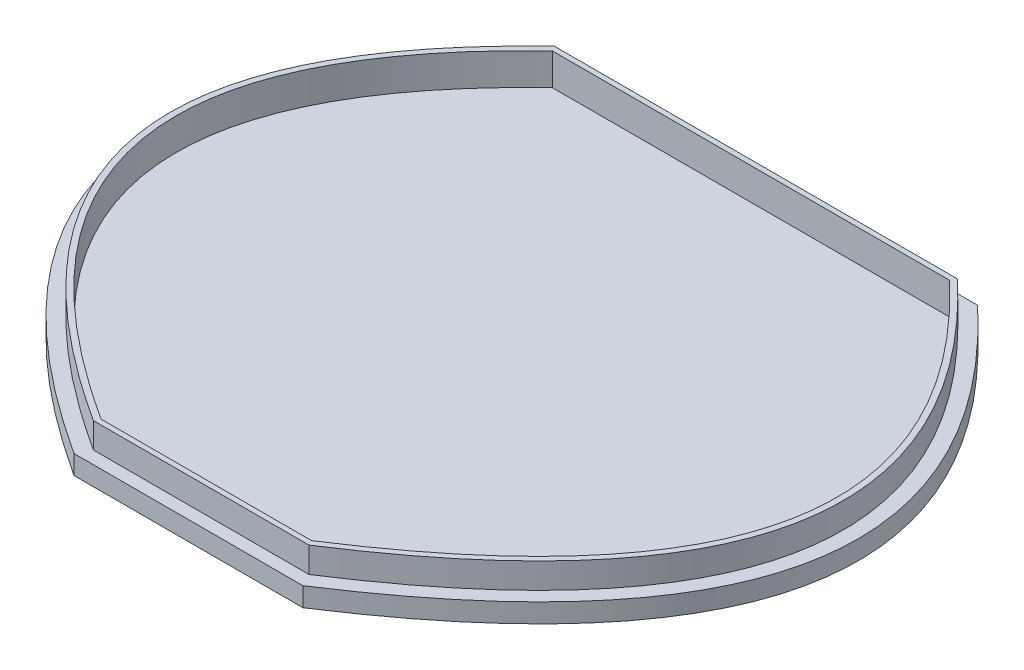
ISO-10303-21;
HEADER;
FILE_DESCRIPTION(('STEP AP214'),'2;1');
FILE_NAME('part.step','',(''),(''),'','','');
FILE_SCHEMA(('AUTOMOTIVE_DESIGN { 1 0 10303 214 1 1 1 1 }'));
ENDSEC;
DATA;
#1=APPLICATION_CONTEXT('core data for automotive mechanical design processes');
#2=APPLICATION_PROTOCOL_DEFINITION('international standard','automotive_design',2000,#1);
#3=PRODUCT_CONTEXT('',#1,'mechanical');
#4=PRODUCT('Part','Part','',(#3));
#5=PRODUCT_RELATED_PRODUCT_CATEGORY('part','',(#4));
#6=PRODUCT_DEFINITION_FORMATION('','',#4);
#7=PRODUCT_DEFINITION_CONTEXT('part definition',#1,'design');
#8=PRODUCT_DEFINITION('design','',#6,#7);
#9=PRODUCT_DEFINITION_SHAPE('','',#8);
#10=(LENGTH_UNIT() NAMED_UNIT(*) SI_UNIT(.MILLI.,.METRE.));
#11=(NAMED_UNIT(*) PLANE_ANGLE_UNIT() SI_UNIT($,.RADIAN.));
#12=(NAMED_UNIT(*) SI_UNIT($,.STERADIAN.) SOLID_ANGLE_UNIT());
#13=UNCERTAINTY_MEASURE_WITH_UNIT(LENGTH_MEASURE(1.E-05),#10,'distance_accuracy_value','');
#14=(GEOMETRIC_REPRESENTATION_CONTEXT(3) GLOBAL_UNCERTAINTY_ASSIGNED_CONTEXT((#13)) GLOBAL_UNIT_ASSIGNED_CONTEXT((#10,
#11,#12)) REPRESENTATION_CONTEXT('',''));
#15=CARTESIAN_POINT('',(0.,0.,0.));
#16=DIRECTION('',(0.,0.,1.));
#17=DIRECTION('',(1.,0.,0.));
#18=AXIS2_PLACEMENT_3D('',#15,#16,#17);
#19=CARTESIAN_POINT('',(0.,1.905,0.));
#20=DIRECTION('',(0.,1.,0.));
#21=DIRECTION('',(0.,0.,1.));
#22=AXIS2_PLACEMENT_3D('',#19,#20,#21);
#23=PLANE('',#22);
#24=DIRECTION('',(1.,0.,0.));
#25=VECTOR('',#24,1.);
#26=CARTESIAN_POINT('',(0.,1.905,27.3456207965844));
#27=LINE('',#26,#25);
#28=CARTESIAN_POINT('',(-9.30426957522342,1.905,27.3456207965844));
#29=VERTEX_POINT('',#28);
#30=CARTESIAN_POINT('',(13.5115412232386,1.905,27.3456207965844));
#31=VERTEX_POINT('',#30);
#32=EDGE_CURVE('E243',#29,#31,#27,.T.);
#33=ORIENTED_EDGE('',*,*,#32,.T.);
#34=CARTESIAN_POINT('',(13.5115412232386,1.905,27.3456207965844));
#35=CARTESIAN_POINT('',(55.4788365566822,1.905,0.155478180471982));
#36=CARTESIAN_POINT('',(22.9204523888184,1.905,-30.4890265040843));
#37=B_SPLINE_CURVE_WITH_KNOTS('',2,(#34,#35,#36),.UNSPECIFIED.,.F.,.F.,(3,3),(0.,1.),.UNSPECIFIED.);
#38=CARTESIAN_POINT('',(22.9204523888184,1.905,-30.4890265040843));
#39=VERTEX_POINT('',#38);
#40=EDGE_CURVE('E315',#31,#39,#37,.T.);
#41=ORIENTED_EDGE('',*,*,#40,.T.);
#42=DIRECTION('',(-1.,0.,0.));
#43=VECTOR('',#42,1.);
#44=CARTESIAN_POINT('',(-2.05799595706835E-13,1.905,-30.4890265040841));
#45=LINE('',#44,#43);
#46=CARTESIAN_POINT('',(-18.7131807408036,1.905,-30.4890265040841));
#47=VERTEX_POINT('',#46);
#48=EDGE_CURVE('E314',#39,#47,#45,.T.);
#49=ORIENTED_EDGE('',*,*,#48,.T.);
#50=CARTESIAN_POINT('',(-18.7131807408036,1.905,-30.4890265040841));
#51=CARTESIAN_POINT('',(-51.2715649086662,1.905,0.155478180472475));
#52=CARTESIAN_POINT('',(-9.30426957522342,1.905,27.3456207965844));
#53=B_SPLINE_CURVE_WITH_KNOTS('',2,(#50,#51,#52),.UNSPECIFIED.,.F.,.F.,(3,3),(0.,1.),.UNSPECIFIED.);
#54=EDGE_CURVE('E247',#47,#29,#53,.T.);
#55=ORIENTED_EDGE('',*,*,#54,.T.);
#56=EDGE_LOOP('',(#33,#41,#49,#55));
#57=FACE_BOUND('',#56,.T.);
#58=DIRECTION('',(1.,0.,0.));
#59=VECTOR('',#58,1.);
#60=CARTESIAN_POINT('',(12.854748907854,1.905,26.0756207965844));
#61=LINE('',#60,#59);
#62=CARTESIAN_POINT('',(-8.64747725983883,1.905,26.0756207965844));
#63=VERTEX_POINT('',#62);
#64=CARTESIAN_POINT('',(12.854748907854,1.905,26.0756207965844));
#65=VERTEX_POINT('',#64);
#66=EDGE_CURVE('E344',#63,#65,#61,.T.);
#67=ORIENTED_EDGE('',*,*,#66,.F.);
#68=CARTESIAN_POINT('',(-17.9799458989325,1.905,-29.219026504084));
#69=CARTESIAN_POINT('',(-48.9500127558173,1.905,0.0800860043630085));
#70=CARTESIAN_POINT('',(-8.64747725983883,1.905,26.0756207965844));
#71=B_SPLINE_CURVE_WITH_KNOTS('',2,(#68,#69,#70),.UNSPECIFIED.,.F.,.F.,(3,3),(0.,1.),.UNSPECIFIED.);
#72=CARTESIAN_POINT('',(-17.9799458989325,1.905,-29.219026504084));
#73=VERTEX_POINT('',#72);
#74=EDGE_CURVE('E187',#73,#63,#71,.T.);
#75=ORIENTED_EDGE('',*,*,#74,.F.);
#76=DIRECTION('',(-1.,0.,0.));
#77=VECTOR('',#76,1.);
#78=CARTESIAN_POINT('',(22.1872175469476,1.905,-29.2190265040843));
#79=LINE('',#78,#77);
#80=CARTESIAN_POINT('',(22.1872175469476,1.905,-29.2190265040843));
#81=VERTEX_POINT('',#80);
#82=EDGE_CURVE('E195',#81,#73,#79,.T.);
#83=ORIENTED_EDGE('',*,*,#82,.F.);
#84=CARTESIAN_POINT('',(12.854748907854,1.905,26.0756207965844));
#85=CARTESIAN_POINT('',(53.1572844038333,1.905,0.0800860043624042));
#86=CARTESIAN_POINT('',(22.1872175469476,1.905,-29.2190265040843));
#87=B_SPLINE_CURVE_WITH_KNOTS('',2,(#84,#85,#86),.UNSPECIFIED.,.F.,.F.,(3,3),(0.,1.),.UNSPECIFIED.);
#88=EDGE_CURVE('E340',#65,#81,#87,.T.);
#89=ORIENTED_EDGE('',*,*,#88,.F.);
#90=EDGE_LOOP('',(#67,#75,#83,#89));
#91=FACE_BOUND('',#90,.T.);
#92=ADVANCED_FACE('F60',(#57,#91),#23,.T.);
#93=CARTESIAN_POINT('',(-2.05799595706835E-13,1.27,-30.4890265040841));
#94=DIRECTION('',(0.,0.,-1.));
#95=DIRECTION('',(-1.,0.,0.));
#96=AXIS2_PLACEMENT_3D('',#93,#94,#95);
#97=PLANE('',#96);
#98=DIRECTION('',(1.,0.,0.));
#99=VECTOR('',#98,1.);
#100=CARTESIAN_POINT('',(-2.05799595706835E-13,0.,-30.4890265040841));
#101=LINE('',#100,#99);
#102=CARTESIAN_POINT('',(-18.7131807408033,0.,-30.489026504084));
#103=VERTEX_POINT('',#102);
#104=CARTESIAN_POINT('',(22.9204523888184,0.,-30.4890265040843));
#105=VERTEX_POINT('',#104);
#106=EDGE_CURVE('E282',#103,#105,#101,.T.);
#107=ORIENTED_EDGE('',*,*,#106,.F.);
#108=DIRECTION('',(0.,-1.,0.));
#109=VECTOR('',#108,1.);
#110=CARTESIAN_POINT('',(-18.7131807408033,1.27,-30.489026504084));
#111=LINE('',#110,#109);
#112=EDGE_CURVE('E69',#47,#103,#111,.T.);
#113=ORIENTED_EDGE('',*,*,#112,.F.);
#114=ORIENTED_EDGE('',*,*,#48,.F.);
#115=DIRECTION('',(0.,-1.,0.));
#116=VECTOR('',#115,1.);
#117=CARTESIAN_POINT('',(22.9204523888184,1.27,-30.4890265040843));
#118=LINE('',#117,#116);
#119=EDGE_CURVE('E12',#39,#105,#118,.T.);
#120=ORIENTED_EDGE('',*,*,#119,.T.);
#121=EDGE_LOOP('',(#107,#113,#114,#120));
#122=FACE_BOUND('',#121,.T.);
#123=ADVANCED_FACE('F210',(#122),#97,.T.);
#124=CARTESIAN_POINT('',(-18.7131807408036,1.27,-30.4890265040841));
#125=CARTESIAN_POINT('',(-51.2715649086662,1.27,0.155478180472475));
#126=CARTESIAN_POINT('',(-9.30426957522342,1.27,27.3456207965844));
#127=B_SPLINE_CURVE_WITH_KNOTS('',2,(#124,#125,#126),.UNSPECIFIED.,.F.,.F.,(3,3),(0.,1.),.UNSPECIFIED.);
#128=DIRECTION('',(0.,-1.,0.));
#129=VECTOR('',#128,1.);
#130=SURFACE_OF_LINEAR_EXTRUSION('',#127,#129);
#131=CARTESIAN_POINT('',(-18.7131807408036,0.,-30.4890265040841));
#132=CARTESIAN_POINT('',(-51.2715649086662,0.,0.155478180472475));
#133=CARTESIAN_POINT('',(-9.30426957522342,0.,27.3456207965844));
#134=B_SPLINE_CURVE_WITH_KNOTS('',2,(#131,#132,#133),.UNSPECIFIED.,.F.,.F.,(3,3),(0.,1.),.UNSPECIFIED.);
#135=CARTESIAN_POINT('',(-9.30426957522342,0.,27.3456207965844));
#136=VERTEX_POINT('',#135);
#137=EDGE_CURVE('E289',#103,#136,#134,.T.);
#138=ORIENTED_EDGE('',*,*,#137,.T.);
#139=DIRECTION('',(0.,-1.,0.));
#140=VECTOR('',#139,1.);
#141=CARTESIAN_POINT('',(-9.30426957522342,1.27,27.3456207965844));
#142=LINE('',#141,#140);
#143=EDGE_CURVE('E302',#29,#136,#142,.T.);
#144=ORIENTED_EDGE('',*,*,#143,.F.);
#145=ORIENTED_EDGE('',*,*,#54,.F.);
#146=ORIENTED_EDGE('',*,*,#112,.T.);
#147=EDGE_LOOP('',(#138,#144,#145,#146));
#148=FACE_BOUND('',#147,.T.);
#149=ADVANCED_FACE('F270',(#148),#130,.F.);
#150=CARTESIAN_POINT('',(0.,1.27,27.3456207965844));
#151=DIRECTION('',(0.,0.,-1.));
#152=DIRECTION('',(-1.,0.,0.));
#153=AXIS2_PLACEMENT_3D('',#150,#151,#152);
#154=PLANE('',#153);
#155=DIRECTION('',(1.,0.,0.));
#156=VECTOR('',#155,1.);
#157=CARTESIAN_POINT('',(0.,0.,27.3456207965844));
#158=LINE('',#157,#156);
#159=CARTESIAN_POINT('',(13.5115412232386,0.,27.3456207965844));
#160=VERTEX_POINT('',#159);
#161=EDGE_CURVE('E290',#136,#160,#158,.T.);
#162=ORIENTED_EDGE('',*,*,#161,.T.);
#163=DIRECTION('',(0.,-1.,0.));
#164=VECTOR('',#163,1.);
#165=CARTESIAN_POINT('',(13.5115412232386,1.27,27.3456207965844));
#166=LINE('',#165,#164);
#167=EDGE_CURVE('E300',#31,#160,#166,.T.);
#168=ORIENTED_EDGE('',*,*,#167,.F.);
#169=ORIENTED_EDGE('',*,*,#32,.F.);
#170=ORIENTED_EDGE('',*,*,#143,.T.);
#171=EDGE_LOOP('',(#162,#168,#169,#170));
#172=FACE_BOUND('',#171,.T.);
#173=ADVANCED_FACE('F273',(#172),#154,.F.);
#174=CARTESIAN_POINT('',(22.9204523888184,1.27,-30.4890265040843));
#175=CARTESIAN_POINT('',(55.4788365566822,1.27,0.155478180471982));
#176=CARTESIAN_POINT('',(13.5115412232386,1.27,27.3456207965844));
#177=B_SPLINE_CURVE_WITH_KNOTS('',2,(#174,#175,#176),.UNSPECIFIED.,.F.,.F.,(3,3),(0.,1.),.UNSPECIFIED.);
#178=DIRECTION('',(0.,-1.,0.));
#179=VECTOR('',#178,1.);
#180=SURFACE_OF_LINEAR_EXTRUSION('',#177,#179);
#181=CARTESIAN_POINT('',(22.9204523888184,0.,-30.4890265040843));
#182=CARTESIAN_POINT('',(55.4788365566822,0.,0.155478180471982));
#183=CARTESIAN_POINT('',(13.5115412232386,0.,27.3456207965844));
#184=B_SPLINE_CURVE_WITH_KNOTS('',2,(#181,#182,#183),.UNSPECIFIED.,.F.,.F.,(3,3),(0.,1.),.UNSPECIFIED.);
#185=EDGE_CURVE('E251',#105,#160,#184,.T.);
#186=ORIENTED_EDGE('',*,*,#185,.F.);
#187=ORIENTED_EDGE('',*,*,#119,.F.);
#188=ORIENTED_EDGE('',*,*,#40,.F.);
#189=ORIENTED_EDGE('',*,*,#167,.T.);
#190=EDGE_LOOP('',(#186,#187,#188,#189));
#191=FACE_BOUND('',#190,.T.);
#192=ADVANCED_FACE('F62',(#191),#180,.T.);
#193=CARTESIAN_POINT('',(0.,0.,0.));
#194=DIRECTION('',(0.,1.,0.));
#195=DIRECTION('',(0.,0.,1.));
#196=AXIS2_PLACEMENT_3D('',#193,#194,#195);
#197=PLANE('',#196);
#198=ORIENTED_EDGE('',*,*,#185,.T.);
#199=ORIENTED_EDGE('',*,*,#161,.F.);
#200=ORIENTED_EDGE('',*,*,#137,.F.);
#201=ORIENTED_EDGE('',*,*,#106,.T.);
#202=EDGE_LOOP('',(#198,#199,#200,#201));
#203=FACE_BOUND('',#202,.T.);
#204=ADVANCED_FACE('F307',(#203),#197,.F.);
#205=CARTESIAN_POINT('',(-31.1318621676015,4.445,-0.745808424693409));
#206=DIRECTION('',(0.,-1.,0.));
#207=DIRECTION('',(0.,0.,-1.));
#208=AXIS2_PLACEMENT_3D('',#205,#206,#207);
#209=PLANE('',#208);
#210=CARTESIAN_POINT('',(-17.9799458989325,4.445,-29.219026504084));
#211=CARTESIAN_POINT('',(-48.9500127558173,4.445,0.0800860043630085));
#212=CARTESIAN_POINT('',(-8.64747725983883,4.445,26.0756207965844));
#213=B_SPLINE_CURVE_WITH_KNOTS('',2,(#210,#211,#212),.UNSPECIFIED.,.F.,.F.,(3,3),(0.,1.),.UNSPECIFIED.);
#214=CARTESIAN_POINT('',(-17.9799458989325,4.445,-29.219026504084));
#215=VERTEX_POINT('',#214);
#216=CARTESIAN_POINT('',(-8.64747725983883,4.445,26.0756207965844));
#217=VERTEX_POINT('',#216);
#218=EDGE_CURVE('E188',#215,#217,#213,.T.);
#219=ORIENTED_EDGE('',*,*,#218,.T.);
#220=DIRECTION('',(1.,0.,0.));
#221=VECTOR('',#220,1.);
#222=CARTESIAN_POINT('',(12.854748907854,4.445,26.0756207965844));
#223=LINE('',#222,#221);
#224=CARTESIAN_POINT('',(12.854748907854,4.445,26.0756207965844));
#225=VERTEX_POINT('',#224);
#226=EDGE_CURVE('E194',#217,#225,#223,.T.);
#227=ORIENTED_EDGE('',*,*,#226,.T.);
#228=CARTESIAN_POINT('',(12.854748907854,4.445,26.0756207965844));
#229=CARTESIAN_POINT('',(53.1572844038333,4.445,0.0800860043624042));
#230=CARTESIAN_POINT('',(22.1872175469476,4.445,-29.2190265040843));
#231=B_SPLINE_CURVE_WITH_KNOTS('',2,(#228,#229,#230),.UNSPECIFIED.,.F.,.F.,(3,3),(0.,1.),.UNSPECIFIED.);
#232=CARTESIAN_POINT('',(22.1872175469476,4.445,-29.2190265040843));
#233=VERTEX_POINT('',#232);
#234=EDGE_CURVE('E356',#225,#233,#231,.T.);
#235=ORIENTED_EDGE('',*,*,#234,.T.);
#236=DIRECTION('',(-1.,0.,0.));
#237=VECTOR('',#236,1.);
#238=CARTESIAN_POINT('',(22.1872175469476,4.445,-29.2190265040843));
#239=LINE('',#238,#237);
#240=EDGE_CURVE('E338',#233,#215,#239,.T.);
#241=ORIENTED_EDGE('',*,*,#240,.T.);
#242=EDGE_LOOP('',(#219,#227,#235,#241));
#243=FACE_BOUND('',#242,.T.);
#244=CARTESIAN_POINT('',(-17.6866519621841,4.445,-28.711026504084));
#245=CARTESIAN_POINT('',(-48.0213918946777,4.445,0.0499291339193584));
#246=CARTESIAN_POINT('',(-8.38476033368421,4.445,25.5676207965845));
#247=B_SPLINE_CURVE_WITH_KNOTS('',2,(#244,#245,#246),.UNSPECIFIED.,.F.,.F.,(3,3),(0.,1.),.UNSPECIFIED.);
#248=CARTESIAN_POINT('',(-17.6866519621841,4.445,-28.711026504084));
#249=VERTEX_POINT('',#248);
#250=CARTESIAN_POINT('',(-8.38476033368421,4.445,25.5676207965845));
#251=VERTEX_POINT('',#250);
#252=EDGE_CURVE('E165',#249,#251,#247,.T.);
#253=ORIENTED_EDGE('',*,*,#252,.F.);
#254=DIRECTION('',(-1.,0.,0.));
#255=VECTOR('',#254,1.);
#256=CARTESIAN_POINT('',(-17.6866519621841,4.445,-28.711026504084));
#257=LINE('',#256,#255);
#258=CARTESIAN_POINT('',(21.8939236101994,4.445,-28.711026504084));
#259=VERTEX_POINT('',#258);
#260=EDGE_CURVE('E176',#259,#249,#257,.T.);
#261=ORIENTED_EDGE('',*,*,#260,.F.);
#262=CARTESIAN_POINT('',(12.5920319817001,4.445,25.5676207965845));
#263=CARTESIAN_POINT('',(52.2286635426936,4.445,0.0499291339187544));
#264=CARTESIAN_POINT('',(21.8939236101994,4.445,-28.711026504084));
#265=B_SPLINE_CURVE_WITH_KNOTS('',2,(#262,#263,#264),.UNSPECIFIED.,.F.,.F.,(3,3),(0.,1.),.UNSPECIFIED.);
#266=CARTESIAN_POINT('',(12.5920319817001,4.445,25.5676207965845));
#267=VERTEX_POINT('',#266);
#268=EDGE_CURVE('E174',#267,#259,#265,.T.);
#269=ORIENTED_EDGE('',*,*,#268,.F.);
#270=DIRECTION('',(1.,0.,0.));
#271=VECTOR('',#270,1.);
#272=CARTESIAN_POINT('',(-8.38476033368421,4.445,25.5676207965845));
#273=LINE('',#272,#271);
#274=EDGE_CURVE('E156',#251,#267,#273,.T.);
#275=ORIENTED_EDGE('',*,*,#274,.F.);
#276=EDGE_LOOP('',(#253,#261,#269,#275));
#277=FACE_BOUND('',#276,.T.);
#278=ADVANCED_FACE('F172',(#243,#277),#209,.F.);
#279=DIRECTION('',(0.,-1.,0.));
#280=VECTOR('',#279,1.);
#281=SURFACE_OF_LINEAR_EXTRUSION('',#213,#280);
#282=ORIENTED_EDGE('',*,*,#74,.T.);
#283=DIRECTION('',(0.,-1.,0.));
#284=VECTOR('',#283,1.);
#285=CARTESIAN_POINT('',(-8.64747725983883,4.445,26.0756207965844));
#286=LINE('',#285,#284);
#287=EDGE_CURVE('E231',#217,#63,#286,.T.);
#288=ORIENTED_EDGE('',*,*,#287,.F.);
#289=ORIENTED_EDGE('',*,*,#218,.F.);
#290=DIRECTION('',(0.,-1.,0.));
#291=VECTOR('',#290,1.);
#292=CARTESIAN_POINT('',(-17.9799458989325,4.445,-29.219026504084));
#293=LINE('',#292,#291);
#294=EDGE_CURVE('E335',#215,#73,#293,.T.);
#295=ORIENTED_EDGE('',*,*,#294,.T.);
#296=EDGE_LOOP('',(#282,#288,#289,#295));
#297=FACE_BOUND('',#296,.T.);
#298=ADVANCED_FACE('F201',(#297),#281,.F.);
#299=CARTESIAN_POINT('',(12.854748907854,4.445,26.0756207965844));
#300=DIRECTION('',(0.,0.,-1.));
#301=DIRECTION('',(-1.,0.,0.));
#302=AXIS2_PLACEMENT_3D('',#299,#300,#301);
#303=PLANE('',#302);
#304=ORIENTED_EDGE('',*,*,#66,.T.);
#305=DIRECTION('',(0.,-1.,0.));
#306=VECTOR('',#305,1.);
#307=CARTESIAN_POINT('',(12.854748907854,4.445,26.0756207965844));
#308=LINE('',#307,#306);
#309=EDGE_CURVE('E331',#225,#65,#308,.T.);
#310=ORIENTED_EDGE('',*,*,#309,.F.);
#311=ORIENTED_EDGE('',*,*,#226,.F.);
#312=ORIENTED_EDGE('',*,*,#287,.T.);
#313=EDGE_LOOP('',(#304,#310,#311,#312));
#314=FACE_BOUND('',#313,.T.);
#315=ADVANCED_FACE('F205',(#314),#303,.F.);
#316=DIRECTION('',(0.,-1.,0.));
#317=VECTOR('',#316,1.);
#318=SURFACE_OF_LINEAR_EXTRUSION('',#231,#317);
#319=ORIENTED_EDGE('',*,*,#88,.T.);
#320=DIRECTION('',(0.,-1.,0.));
#321=VECTOR('',#320,1.);
#322=CARTESIAN_POINT('',(22.1872175469476,4.445,-29.2190265040843));
#323=LINE('',#322,#321);
#324=EDGE_CURVE('E76',#233,#81,#323,.T.);
#325=ORIENTED_EDGE('',*,*,#324,.F.);
#326=ORIENTED_EDGE('',*,*,#234,.F.);
#327=ORIENTED_EDGE('',*,*,#309,.T.);
#328=EDGE_LOOP('',(#319,#325,#326,#327));
#329=FACE_BOUND('',#328,.T.);
#330=ADVANCED_FACE('F363',(#329),#318,.F.);
#331=CARTESIAN_POINT('',(22.1872175469476,4.445,-29.2190265040843));
#332=DIRECTION('',(0.,0.,1.));
#333=DIRECTION('',(1.,0.,0.));
#334=AXIS2_PLACEMENT_3D('',#331,#332,#333);
#335=PLANE('',#334);
#336=ORIENTED_EDGE('',*,*,#82,.T.);
#337=ORIENTED_EDGE('',*,*,#294,.F.);
#338=ORIENTED_EDGE('',*,*,#240,.F.);
#339=ORIENTED_EDGE('',*,*,#324,.T.);
#340=EDGE_LOOP('',(#336,#337,#338,#339));
#341=FACE_BOUND('',#340,.T.);
#342=ADVANCED_FACE('F366',(#341),#335,.F.);
#343=CARTESIAN_POINT('',(0.,1.27,0.));
#344=DIRECTION('',(0.,1.,0.));
#345=DIRECTION('',(0.,0.,1.));
#346=AXIS2_PLACEMENT_3D('',#343,#344,#345);
#347=PLANE('',#346);
#348=CARTESIAN_POINT('',(21.8939236101994,1.27,-28.711026504084));
#349=CARTESIAN_POINT('',(52.2286635426936,1.27,0.0499291339187626));
#350=CARTESIAN_POINT('',(12.5920319817001,1.27,25.5676207965845));
#351=B_SPLINE_CURVE_WITH_KNOTS('',2,(#348,#349,#350),.UNSPECIFIED.,.F.,.F.,(3,3),(0.,1.),.UNSPECIFIED.);
#352=CARTESIAN_POINT('',(21.8939236101994,1.27,-28.711026504084));
#353=VERTEX_POINT('',#352);
#354=CARTESIAN_POINT('',(12.5920319817001,1.27,25.5676207965845));
#355=VERTEX_POINT('',#354);
#356=EDGE_CURVE('E84',#353,#355,#351,.T.);
#357=ORIENTED_EDGE('',*,*,#356,.F.);
#358=DIRECTION('',(1.,0.,0.));
#359=VECTOR('',#358,1.);
#360=CARTESIAN_POINT('',(0.,1.27,-28.711026504084));
#361=LINE('',#360,#359);
#362=CARTESIAN_POINT('',(-17.6866519621841,1.27,-28.711026504084));
#363=VERTEX_POINT('',#362);
#364=EDGE_CURVE('E225',#363,#353,#361,.T.);
#365=ORIENTED_EDGE('',*,*,#364,.F.);
#366=CARTESIAN_POINT('',(-17.6866519621841,1.27,-28.711026504084));
#367=CARTESIAN_POINT('',(-48.0213918946777,1.27,0.0499291339193697));
#368=CARTESIAN_POINT('',(-8.38476033368421,1.27,25.5676207965845));
#369=B_SPLINE_CURVE_WITH_KNOTS('',2,(#366,#367,#368),.UNSPECIFIED.,.F.,.F.,(3,3),(0.,1.),.UNSPECIFIED.);
#370=CARTESIAN_POINT('',(-8.38476033368421,1.27,25.5676207965845));
#371=VERTEX_POINT('',#370);
#372=EDGE_CURVE('E239',#363,#371,#369,.T.);
#373=ORIENTED_EDGE('',*,*,#372,.T.);
#374=DIRECTION('',(-1.,0.,0.));
#375=VECTOR('',#374,1.);
#376=CARTESIAN_POINT('',(0.,1.27,25.5676207965845));
#377=LINE('',#376,#375);
#378=EDGE_CURVE('E158',#355,#371,#377,.T.);
#379=ORIENTED_EDGE('',*,*,#378,.F.);
#380=EDGE_LOOP('',(#357,#365,#373,#379));
#381=FACE_BOUND('',#380,.T.);
#382=ADVANCED_FACE('F370',(#381),#347,.T.);
#383=CARTESIAN_POINT('',(0.,1.905,-28.711026504084));
#384=DIRECTION('',(0.,0.,-1.));
#385=DIRECTION('',(-1.,0.,0.));
#386=AXIS2_PLACEMENT_3D('',#383,#384,#385);
#387=PLANE('',#386);
#388=ORIENTED_EDGE('',*,*,#364,.T.);
#389=DIRECTION('',(0.,-1.,0.));
#390=VECTOR('',#389,1.);
#391=CARTESIAN_POINT('',(21.8939236101994,1.905,-28.711026504084));
#392=LINE('',#391,#390);
#393=EDGE_CURVE('E250',#259,#353,#392,.T.);
#394=ORIENTED_EDGE('',*,*,#393,.F.);
#395=ORIENTED_EDGE('',*,*,#260,.T.);
#396=DIRECTION('',(0.,-1.,0.));
#397=VECTOR('',#396,1.);
#398=CARTESIAN_POINT('',(-17.6866519621841,1.905,-28.711026504084));
#399=LINE('',#398,#397);
#400=EDGE_CURVE('E162',#249,#363,#399,.T.);
#401=ORIENTED_EDGE('',*,*,#400,.T.);
#402=EDGE_LOOP('',(#388,#394,#395,#401));
#403=FACE_BOUND('',#402,.T.);
#404=ADVANCED_FACE('F406',(#403),#387,.F.);
#405=CARTESIAN_POINT('',(21.8939236101994,1.905,-28.711026504084));
#406=CARTESIAN_POINT('',(52.2286635426936,1.905,0.0499291339187626));
#407=CARTESIAN_POINT('',(12.5920319817001,1.905,25.5676207965845));
#408=B_SPLINE_CURVE_WITH_KNOTS('',2,(#405,#406,#407),.UNSPECIFIED.,.F.,.F.,(3,3),(0.,1.),.UNSPECIFIED.);
#409=DIRECTION('',(0.,-1.,0.));
#410=VECTOR('',#409,1.);
#411=SURFACE_OF_LINEAR_EXTRUSION('',#408,#410);
#412=ORIENTED_EDGE('',*,*,#356,.T.);
#413=DIRECTION('',(0.,-1.,0.));
#414=VECTOR('',#413,1.);
#415=CARTESIAN_POINT('',(12.5920319817001,1.905,25.5676207965845));
#416=LINE('',#415,#414);
#417=EDGE_CURVE('E161',#267,#355,#416,.T.);
#418=ORIENTED_EDGE('',*,*,#417,.F.);
#419=ORIENTED_EDGE('',*,*,#268,.T.);
#420=ORIENTED_EDGE('',*,*,#393,.T.);
#421=EDGE_LOOP('',(#412,#418,#419,#420));
#422=FACE_BOUND('',#421,.T.);
#423=ADVANCED_FACE('F414',(#422),#411,.F.);
#424=CARTESIAN_POINT('',(0.,1.905,25.5676207965845));
#425=DIRECTION('',(0.,0.,1.));
#426=DIRECTION('',(1.,0.,0.));
#427=AXIS2_PLACEMENT_3D('',#424,#425,#426);
#428=PLANE('',#427);
#429=ORIENTED_EDGE('',*,*,#378,.T.);
#430=DIRECTION('',(0.,-1.,0.));
#431=VECTOR('',#430,1.);
#432=CARTESIAN_POINT('',(-8.38476033368421,1.905,25.5676207965845));
#433=LINE('',#432,#431);
#434=EDGE_CURVE('E151',#251,#371,#433,.T.);
#435=ORIENTED_EDGE('',*,*,#434,.F.);
#436=ORIENTED_EDGE('',*,*,#274,.T.);
#437=ORIENTED_EDGE('',*,*,#417,.T.);
#438=EDGE_LOOP('',(#429,#435,#436,#437));
#439=FACE_BOUND('',#438,.T.);
#440=ADVANCED_FACE('F153',(#439),#428,.F.);
#441=CARTESIAN_POINT('',(-17.6866519621841,1.905,-28.711026504084));
#442=CARTESIAN_POINT('',(-48.0213918946777,1.905,0.0499291339193697));
#443=CARTESIAN_POINT('',(-8.38476033368421,1.905,25.5676207965845));
#444=B_SPLINE_CURVE_WITH_KNOTS('',2,(#441,#442,#443),.UNSPECIFIED.,.F.,.F.,(3,3),(0.,1.),.UNSPECIFIED.);
#445=DIRECTION('',(0.,-1.,0.));
#446=VECTOR('',#445,1.);
#447=SURFACE_OF_LINEAR_EXTRUSION('',#444,#446);
#448=ORIENTED_EDGE('',*,*,#372,.F.);
#449=ORIENTED_EDGE('',*,*,#400,.F.);
#450=ORIENTED_EDGE('',*,*,#252,.T.);
#451=ORIENTED_EDGE('',*,*,#434,.T.);
#452=EDGE_LOOP('',(#448,#449,#450,#451));
#453=FACE_BOUND('',#452,.T.);
#454=ADVANCED_FACE('F166',(#453),#447,.T.);
#455=CLOSED_SHELL('',(#92,#123,#149,#173,#192,#204,#278,#298,#315,#330,#342,#382,#404,#423,#440,#454));
#456=MANIFOLD_SOLID_BREP('B2',#455);
#457=ADVANCED_BREP_SHAPE_REPRESENTATION('',(#18,#456),#14);
#458=SHAPE_DEFINITION_REPRESENTATION(#9,#457);
ENDSEC;
END-ISO-10303-21;
